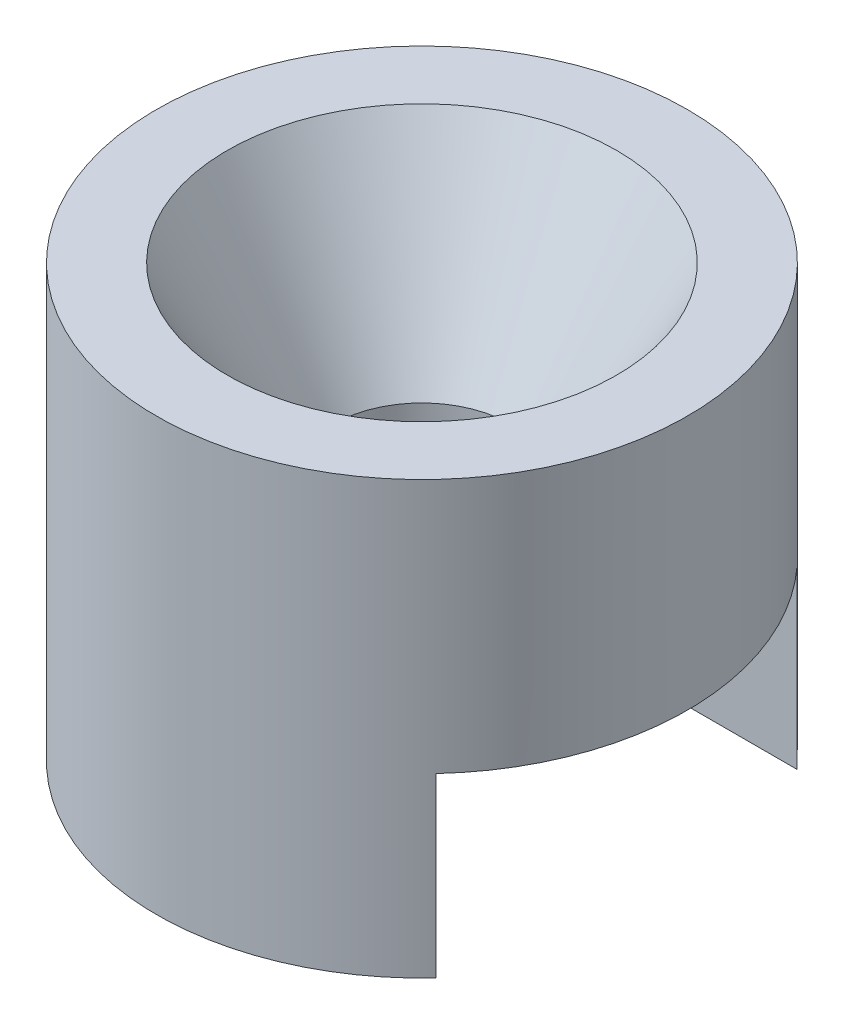
ISO-10303-21;
HEADER;
FILE_DESCRIPTION(('STEP AP214'),'2;1');
FILE_NAME('part.step','',(''),(''),'','','');
FILE_SCHEMA(('AUTOMOTIVE_DESIGN { 1 0 10303 214 1 1 1 1 }'));
ENDSEC;
DATA;
#1=APPLICATION_CONTEXT('core data for automotive mechanical design processes');
#2=APPLICATION_PROTOCOL_DEFINITION('international standard','automotive_design',2000,#1);
#3=PRODUCT_CONTEXT('',#1,'mechanical');
#4=PRODUCT('Part','Part','',(#3));
#5=PRODUCT_RELATED_PRODUCT_CATEGORY('part','',(#4));
#6=PRODUCT_DEFINITION_FORMATION('','',#4);
#7=PRODUCT_DEFINITION_CONTEXT('part definition',#1,'design');
#8=PRODUCT_DEFINITION('design','',#6,#7);
#9=PRODUCT_DEFINITION_SHAPE('','',#8);
#10=(LENGTH_UNIT() NAMED_UNIT(*) SI_UNIT(.MILLI.,.METRE.));
#11=(NAMED_UNIT(*) PLANE_ANGLE_UNIT() SI_UNIT($,.RADIAN.));
#12=(NAMED_UNIT(*) SI_UNIT($,.STERADIAN.) SOLID_ANGLE_UNIT());
#13=UNCERTAINTY_MEASURE_WITH_UNIT(LENGTH_MEASURE(1.E-05),#10,'distance_accuracy_value','');
#14=(GEOMETRIC_REPRESENTATION_CONTEXT(3) GLOBAL_UNCERTAINTY_ASSIGNED_CONTEXT((#13)) GLOBAL_UNIT_ASSIGNED_CONTEXT((#10,
#11,#12)) REPRESENTATION_CONTEXT('',''));
#15=CARTESIAN_POINT('',(0.,0.,0.));
#16=DIRECTION('',(0.,0.,1.));
#17=DIRECTION('',(1.,0.,0.));
#18=AXIS2_PLACEMENT_3D('',#15,#16,#17);
#19=CARTESIAN_POINT('',(0.,0.,0.));
#20=DIRECTION('',(0.,1.,0.));
#21=DIRECTION('',(0.,0.,1.));
#22=AXIS2_PLACEMENT_3D('',#19,#20,#21);
#23=PLANE('',#22);
#24=CARTESIAN_POINT('',(0.,0.,0.));
#25=DIRECTION('',(0.,1.,0.));
#26=DIRECTION('',(0.,0.,1.));
#27=AXIS2_PLACEMENT_3D('',#24,#25,#26);
#28=CIRCLE('',#27,2.5);
#29=CARTESIAN_POINT('',(0.,0.,2.5));
#30=VERTEX_POINT('',#29);
#31=EDGE_CURVE('E104',#30,#30,#28,.T.);
#32=ORIENTED_EDGE('',*,*,#31,.T.);
#33=EDGE_LOOP('',(#32));
#34=FACE_BOUND('',#33,.T.);
#35=CARTESIAN_POINT('',(0.,0.,0.));
#36=DIRECTION('',(0.,1.,0.));
#37=DIRECTION('',(0.,0.,1.));
#38=AXIS2_PLACEMENT_3D('',#35,#36,#37);
#39=CIRCLE('',#38,7.5);
#40=CARTESIAN_POINT('',(-5.49909083394701,0.,-5.1));
#41=VERTEX_POINT('',#40);
#42=CARTESIAN_POINT('',(-5.49909083394701,0.,5.1));
#43=VERTEX_POINT('',#42);
#44=EDGE_CURVE('E38',#41,#43,#39,.T.);
#45=ORIENTED_EDGE('',*,*,#44,.F.);
#46=DIRECTION('',(1.,0.,0.));
#47=VECTOR('',#46,1.);
#48=CARTESIAN_POINT('',(0.,0.,-5.1));
#49=LINE('',#48,#47);
#50=CARTESIAN_POINT('',(5.49909083394701,0.,-5.1));
#51=VERTEX_POINT('',#50);
#52=EDGE_CURVE('E51',#41,#51,#49,.T.);
#53=ORIENTED_EDGE('',*,*,#52,.T.);
#54=CARTESIAN_POINT('',(5.49909083394701,0.,5.1));
#55=VERTEX_POINT('',#54);
#56=EDGE_CURVE('E11',#55,#51,#39,.T.);
#57=ORIENTED_EDGE('',*,*,#56,.F.);
#58=DIRECTION('',(1.,0.,0.));
#59=VECTOR('',#58,1.);
#60=CARTESIAN_POINT('',(0.,0.,5.1));
#61=LINE('',#60,#59);
#62=EDGE_CURVE('E80',#43,#55,#61,.T.);
#63=ORIENTED_EDGE('',*,*,#62,.F.);
#64=EDGE_LOOP('',(#45,#53,#57,#63));
#65=FACE_BOUND('',#64,.T.);
#66=ADVANCED_FACE('F34',(#34,#65),#23,.F.);
#67=CARTESIAN_POINT('',(0.,2.,0.));
#68=DIRECTION('',(0.,-1.,0.));
#69=DIRECTION('',(0.,0.,-1.));
#70=AXIS2_PLACEMENT_3D('',#67,#68,#69);
#71=CYLINDRICAL_SURFACE('',#70,7.5);
#72=ORIENTED_EDGE('',*,*,#56,.T.);
#73=DIRECTION('',(0.,1.,0.));
#74=VECTOR('',#73,1.);
#75=CARTESIAN_POINT('',(5.49909083394701,-5.,-5.1));
#76=LINE('',#75,#74);
#77=CARTESIAN_POINT('',(5.49909083394701,-5.,-5.1));
#78=VERTEX_POINT('',#77);
#79=EDGE_CURVE('E81',#78,#51,#76,.T.);
#80=ORIENTED_EDGE('',*,*,#79,.F.);
#81=CARTESIAN_POINT('',(0.,-5.,0.));
#82=DIRECTION('',(0.,-1.,0.));
#83=DIRECTION('',(0.,0.,-1.));
#84=AXIS2_PLACEMENT_3D('',#81,#82,#83);
#85=CIRCLE('',#84,7.5);
#86=CARTESIAN_POINT('',(-5.49909083394701,-5.,-5.1));
#87=VERTEX_POINT('',#86);
#88=EDGE_CURVE('E84',#87,#78,#85,.T.);
#89=ORIENTED_EDGE('',*,*,#88,.F.);
#90=DIRECTION('',(0.,1.,0.));
#91=VECTOR('',#90,1.);
#92=CARTESIAN_POINT('',(-5.49909083394701,-5.,-5.1));
#93=LINE('',#92,#91);
#94=EDGE_CURVE('E75',#87,#41,#93,.T.);
#95=ORIENTED_EDGE('',*,*,#94,.T.);
#96=ORIENTED_EDGE('',*,*,#44,.T.);
#97=DIRECTION('',(0.,1.,0.));
#98=VECTOR('',#97,1.);
#99=CARTESIAN_POINT('',(-5.49909083394701,-5.,5.1));
#100=LINE('',#99,#98);
#101=CARTESIAN_POINT('',(-5.49909083394701,-5.,5.1));
#102=VERTEX_POINT('',#101);
#103=EDGE_CURVE('E111',#102,#43,#100,.T.);
#104=ORIENTED_EDGE('',*,*,#103,.F.);
#105=CARTESIAN_POINT('',(0.,-5.,0.));
#106=DIRECTION('',(0.,-1.,0.));
#107=DIRECTION('',(0.,0.,-1.));
#108=AXIS2_PLACEMENT_3D('',#105,#106,#107);
#109=CIRCLE('',#108,7.5);
#110=CARTESIAN_POINT('',(5.49909083394701,-5.,5.1));
#111=VERTEX_POINT('',#110);
#112=EDGE_CURVE('E96',#111,#102,#109,.T.);
#113=ORIENTED_EDGE('',*,*,#112,.F.);
#114=DIRECTION('',(0.,1.,0.));
#115=VECTOR('',#114,1.);
#116=CARTESIAN_POINT('',(5.49909083394701,-5.,5.1));
#117=LINE('',#116,#115);
#118=EDGE_CURVE('E101',#111,#55,#117,.T.);
#119=ORIENTED_EDGE('',*,*,#118,.T.);
#120=EDGE_LOOP('',(#72,#80,#89,#95,#96,#104,#113,#119));
#121=FACE_BOUND('',#120,.T.);
#122=CARTESIAN_POINT('',(0.,7.19615242270658,0.));
#123=DIRECTION('',(0.,-1.,0.));
#124=DIRECTION('',(0.,0.,-1.));
#125=AXIS2_PLACEMENT_3D('',#122,#123,#124);
#126=CIRCLE('',#125,7.5);
#127=CARTESIAN_POINT('',(0.,7.19615242270658,-7.5));
#128=VERTEX_POINT('',#127);
#129=EDGE_CURVE('E90',#128,#128,#126,.T.);
#130=ORIENTED_EDGE('',*,*,#129,.T.);
#131=EDGE_LOOP('',(#130));
#132=FACE_BOUND('',#131,.T.);
#133=ADVANCED_FACE('F36',(#121,#132),#71,.T.);
#134=CARTESIAN_POINT('',(0.,2.,0.));
#135=DIRECTION('',(0.,-1.,0.));
#136=DIRECTION('',(0.,0.,-1.));
#137=AXIS2_PLACEMENT_3D('',#134,#135,#136);
#138=CYLINDRICAL_SURFACE('',#137,2.5);
#139=CARTESIAN_POINT('',(0.,2.,0.));
#140=DIRECTION('',(0.,-1.,0.));
#141=DIRECTION('',(0.,0.,-1.));
#142=AXIS2_PLACEMENT_3D('',#139,#140,#141);
#143=CIRCLE('',#142,2.5);
#144=CARTESIAN_POINT('',(0.,2.,-2.5));
#145=VERTEX_POINT('',#144);
#146=EDGE_CURVE('E221',#145,#145,#143,.T.);
#147=ORIENTED_EDGE('',*,*,#146,.F.);
#148=EDGE_LOOP('',(#147));
#149=FACE_BOUND('',#148,.T.);
#150=ORIENTED_EDGE('',*,*,#31,.F.);
#151=EDGE_LOOP('',(#150));
#152=FACE_BOUND('',#151,.T.);
#153=ADVANCED_FACE('F122',(#149,#152),#138,.F.);
#154=CARTESIAN_POINT('',(0.,-5.,5.1));
#155=DIRECTION('',(0.,0.,1.));
#156=DIRECTION('',(1.,0.,0.));
#157=AXIS2_PLACEMENT_3D('',#154,#155,#156);
#158=PLANE('',#157);
#159=ORIENTED_EDGE('',*,*,#62,.T.);
#160=ORIENTED_EDGE('',*,*,#118,.F.);
#161=DIRECTION('',(1.,0.,0.));
#162=VECTOR('',#161,1.);
#163=CARTESIAN_POINT('',(0.,-5.,5.1));
#164=LINE('',#163,#162);
#165=EDGE_CURVE('E99',#102,#111,#164,.T.);
#166=ORIENTED_EDGE('',*,*,#165,.F.);
#167=ORIENTED_EDGE('',*,*,#103,.T.);
#168=EDGE_LOOP('',(#159,#160,#166,#167));
#169=FACE_BOUND('',#168,.T.);
#170=ADVANCED_FACE('F124',(#169),#158,.F.);
#171=CARTESIAN_POINT('',(0.,-5.,0.));
#172=DIRECTION('',(0.,-1.,0.));
#173=DIRECTION('',(0.,0.,-1.));
#174=AXIS2_PLACEMENT_3D('',#171,#172,#173);
#175=PLANE('',#174);
#176=ORIENTED_EDGE('',*,*,#112,.T.);
#177=ORIENTED_EDGE('',*,*,#165,.T.);
#178=EDGE_LOOP('',(#176,#177));
#179=FACE_BOUND('',#178,.T.);
#180=ADVANCED_FACE('F131',(#179),#175,.T.);
#181=CARTESIAN_POINT('',(0.,-5.,-5.1));
#182=DIRECTION('',(0.,0.,1.));
#183=DIRECTION('',(1.,0.,0.));
#184=AXIS2_PLACEMENT_3D('',#181,#182,#183);
#185=PLANE('',#184);
#186=ORIENTED_EDGE('',*,*,#52,.F.);
#187=ORIENTED_EDGE('',*,*,#94,.F.);
#188=DIRECTION('',(1.,0.,0.));
#189=VECTOR('',#188,1.);
#190=CARTESIAN_POINT('',(0.,-5.,-5.1));
#191=LINE('',#190,#189);
#192=EDGE_CURVE('E79',#87,#78,#191,.T.);
#193=ORIENTED_EDGE('',*,*,#192,.T.);
#194=ORIENTED_EDGE('',*,*,#79,.T.);
#195=EDGE_LOOP('',(#186,#187,#193,#194));
#196=FACE_BOUND('',#195,.T.);
#197=ADVANCED_FACE('F77',(#196),#185,.T.);
#198=CARTESIAN_POINT('',(0.,-5.,0.));
#199=DIRECTION('',(0.,-1.,0.));
#200=DIRECTION('',(0.,0.,-1.));
#201=AXIS2_PLACEMENT_3D('',#198,#199,#200);
#202=PLANE('',#201);
#203=ORIENTED_EDGE('',*,*,#192,.F.);
#204=ORIENTED_EDGE('',*,*,#88,.T.);
#205=EDGE_LOOP('',(#203,#204));
#206=FACE_BOUND('',#205,.T.);
#207=ADVANCED_FACE('F88',(#206),#202,.T.);
#208=CARTESIAN_POINT('',(5.5,7.19615242270658,0.));
#209=DIRECTION('',(0.,1.,0.));
#210=DIRECTION('',(0.,0.,1.));
#211=AXIS2_PLACEMENT_3D('',#208,#209,#210);
#212=PLANE('',#211);
#213=CARTESIAN_POINT('',(0.,7.19615242270658,0.));
#214=DIRECTION('',(0.,-1.,0.));
#215=DIRECTION('',(0.,0.,-1.));
#216=AXIS2_PLACEMENT_3D('',#213,#214,#215);
#217=CIRCLE('',#216,5.5);
#218=CARTESIAN_POINT('',(0.,7.19615242270658,-5.5));
#219=VERTEX_POINT('',#218);
#220=EDGE_CURVE('E224',#219,#219,#217,.T.);
#221=ORIENTED_EDGE('',*,*,#220,.T.);
#222=EDGE_LOOP('',(#221));
#223=FACE_BOUND('',#222,.T.);
#224=ORIENTED_EDGE('',*,*,#129,.F.);
#225=EDGE_LOOP('',(#224));
#226=FACE_BOUND('',#225,.T.);
#227=ADVANCED_FACE('F154',(#223,#226),#212,.T.);
#228=CARTESIAN_POINT('',(0.,7.19615242270658,0.));
#229=DIRECTION('',(0.,1.,0.));
#230=DIRECTION('',(0.,0.,1.));
#231=AXIS2_PLACEMENT_3D('',#228,#229,#230);
#232=CONICAL_SURFACE('',#231,5.5,0.523598775598303);
#233=ORIENTED_EDGE('',*,*,#146,.T.);
#234=EDGE_LOOP('',(#233));
#235=FACE_BOUND('',#234,.T.);
#236=ORIENTED_EDGE('',*,*,#220,.F.);
#237=EDGE_LOOP('',(#236));
#238=FACE_BOUND('',#237,.T.);
#239=ADVANCED_FACE('F158',(#235,#238),#232,.F.);
#240=CLOSED_SHELL('',(#66,#133,#153,#170,#180,#197,#207,#227,#239));
#241=MANIFOLD_SOLID_BREP('B2',#240);
#242=ADVANCED_BREP_SHAPE_REPRESENTATION('',(#18,#241),#14);
#243=SHAPE_DEFINITION_REPRESENTATION(#9,#242);
ENDSEC;
END-ISO-10303-21;
